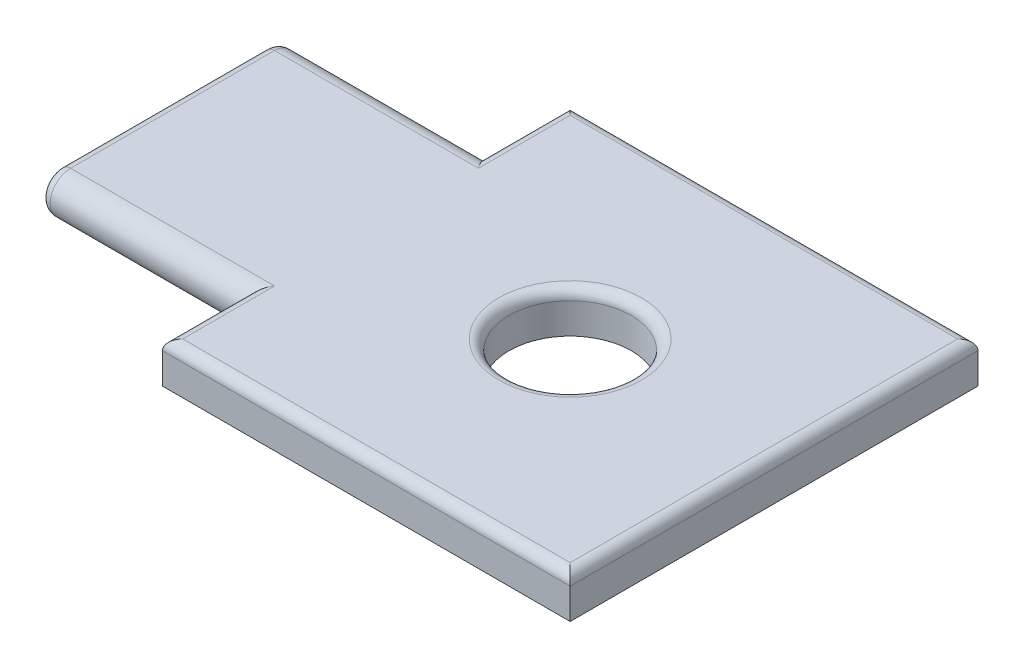
ISO-10303-21;
HEADER;
FILE_DESCRIPTION(('STEP AP214'),'2;1');
FILE_NAME('part.step','',(''),(''),'','','');
FILE_SCHEMA(('AUTOMOTIVE_DESIGN { 1 0 10303 214 1 1 1 1 }'));
ENDSEC;
DATA;
#1=APPLICATION_CONTEXT('core data for automotive mechanical design processes');
#2=APPLICATION_PROTOCOL_DEFINITION('international standard','automotive_design',2000,#1);
#3=PRODUCT_CONTEXT('',#1,'mechanical');
#4=PRODUCT('Part','Part','',(#3));
#5=PRODUCT_RELATED_PRODUCT_CATEGORY('part','',(#4));
#6=PRODUCT_DEFINITION_FORMATION('','',#4);
#7=PRODUCT_DEFINITION_CONTEXT('part definition',#1,'design');
#8=PRODUCT_DEFINITION('design','',#6,#7);
#9=PRODUCT_DEFINITION_SHAPE('','',#8);
#10=(LENGTH_UNIT() NAMED_UNIT(*) SI_UNIT(.MILLI.,.METRE.));
#11=(NAMED_UNIT(*) PLANE_ANGLE_UNIT() SI_UNIT($,.RADIAN.));
#12=(NAMED_UNIT(*) SI_UNIT($,.STERADIAN.) SOLID_ANGLE_UNIT());
#13=UNCERTAINTY_MEASURE_WITH_UNIT(LENGTH_MEASURE(1.E-05),#10,'distance_accuracy_value','');
#14=(GEOMETRIC_REPRESENTATION_CONTEXT(3) GLOBAL_UNCERTAINTY_ASSIGNED_CONTEXT((#13)) GLOBAL_UNIT_ASSIGNED_CONTEXT((#10,
#11,#12)) REPRESENTATION_CONTEXT('',''));
#15=CARTESIAN_POINT('',(0.,0.,0.));
#16=DIRECTION('',(0.,0.,1.));
#17=DIRECTION('',(1.,0.,0.));
#18=AXIS2_PLACEMENT_3D('',#15,#16,#17);
#19=CARTESIAN_POINT('',(-100.,20.,100.));
#20=DIRECTION('',(1.,0.,0.));
#21=DIRECTION('',(0.,0.,-1.));
#22=AXIS2_PLACEMENT_3D('',#19,#20,#21);
#23=PLANE('',#22);
#24=CARTESIAN_POINT('',(-100.,9.99999999999998,-50.));
#25=DIRECTION('',(-1.,0.,0.));
#26=DIRECTION('',(0.,0.,1.));
#27=AXIS2_PLACEMENT_3D('',#24,#25,#26);
#28=CIRCLE('',#27,10.);
#29=CARTESIAN_POINT('',(-100.,15.,-58.6602540378444));
#30=VERTEX_POINT('',#29);
#31=CARTESIAN_POINT('',(-100.,0.,-50.));
#32=VERTEX_POINT('',#31);
#33=EDGE_CURVE('E335',#30,#32,#28,.T.);
#34=ORIENTED_EDGE('',*,*,#33,.F.);
#35=DIRECTION('',(0.,0.,1.));
#36=VECTOR('',#35,1.);
#37=CARTESIAN_POINT('',(-100.,15.,100.));
#38=LINE('',#37,#36);
#39=CARTESIAN_POINT('',(-100.,15.,-100.));
#40=VERTEX_POINT('',#39);
#41=EDGE_CURVE('E70',#30,#40,#38,.F.);
#42=ORIENTED_EDGE('',*,*,#41,.T.);
#43=DIRECTION('',(0.,-1.,0.));
#44=VECTOR('',#43,1.);
#45=CARTESIAN_POINT('',(-100.,20.,-100.));
#46=LINE('',#45,#44);
#47=CARTESIAN_POINT('',(-100.,0.,-100.));
#48=VERTEX_POINT('',#47);
#49=EDGE_CURVE('E150',#40,#48,#46,.T.);
#50=ORIENTED_EDGE('',*,*,#49,.T.);
#51=DIRECTION('',(0.,0.,1.));
#52=VECTOR('',#51,1.);
#53=CARTESIAN_POINT('',(-100.,0.,100.));
#54=LINE('',#53,#52);
#55=EDGE_CURVE('E161',#48,#32,#54,.T.);
#56=ORIENTED_EDGE('',*,*,#55,.T.);
#57=EDGE_LOOP('',(#34,#42,#50,#56));
#58=FACE_BOUND('',#57,.T.);
#59=ADVANCED_FACE('F43',(#58),#23,.F.);
#60=CARTESIAN_POINT('',(0.,20.,0.));
#61=DIRECTION('',(0.,-1.,0.));
#62=DIRECTION('',(0.,0.,-1.));
#63=AXIS2_PLACEMENT_3D('',#60,#61,#62);
#64=PLANE('',#63);
#65=CARTESIAN_POINT('',(0.,20.,0.));
#66=DIRECTION('',(0.,-1.,0.));
#67=DIRECTION('',(0.,0.,-1.));
#68=AXIS2_PLACEMENT_3D('',#65,#66,#67);
#69=CIRCLE('',#68,35.);
#70=CARTESIAN_POINT('',(0.,20.,-35.));
#71=VERTEX_POINT('',#70);
#72=EDGE_CURVE('E236',#71,#71,#69,.T.);
#73=ORIENTED_EDGE('',*,*,#72,.T.);
#74=EDGE_LOOP('',(#73));
#75=FACE_BOUND('',#74,.T.);
#76=DIRECTION('',(1.,0.,0.));
#77=VECTOR('',#76,1.);
#78=CARTESIAN_POINT('',(-200.,20.,-50.));
#79=LINE('',#78,#77);
#80=CARTESIAN_POINT('',(-195.,20.,-50.));
#81=VERTEX_POINT('',#80);
#82=CARTESIAN_POINT('',(-95.,20.,-50.));
#83=VERTEX_POINT('',#82);
#84=EDGE_CURVE('E356',#81,#83,#79,.T.);
#85=ORIENTED_EDGE('',*,*,#84,.F.);
#86=DIRECTION('',(0.,0.,-1.));
#87=VECTOR('',#86,1.);
#88=CARTESIAN_POINT('',(-195.,20.,50.));
#89=LINE('',#88,#87);
#90=CARTESIAN_POINT('',(-195.,20.,50.));
#91=VERTEX_POINT('',#90);
#92=EDGE_CURVE('E233',#81,#91,#89,.F.);
#93=ORIENTED_EDGE('',*,*,#92,.T.);
#94=DIRECTION('',(1.,0.,0.));
#95=VECTOR('',#94,1.);
#96=CARTESIAN_POINT('',(-200.,20.,50.));
#97=LINE('',#96,#95);
#98=CARTESIAN_POINT('',(-95.,20.,50.));
#99=VERTEX_POINT('',#98);
#100=EDGE_CURVE('E367',#91,#99,#97,.T.);
#101=ORIENTED_EDGE('',*,*,#100,.T.);
#102=DIRECTION('',(0.,0.,1.));
#103=VECTOR('',#102,1.);
#104=CARTESIAN_POINT('',(-95.,20.,0.));
#105=LINE('',#104,#103);
#106=CARTESIAN_POINT('',(-95.,20.,95.));
#107=VERTEX_POINT('',#106);
#108=EDGE_CURVE('E230',#99,#107,#105,.T.);
#109=ORIENTED_EDGE('',*,*,#108,.T.);
#110=DIRECTION('',(1.,0.,0.));
#111=VECTOR('',#110,1.);
#112=CARTESIAN_POINT('',(0.,20.,95.));
#113=LINE('',#112,#111);
#114=CARTESIAN_POINT('',(95.,20.,95.));
#115=VERTEX_POINT('',#114);
#116=EDGE_CURVE('E226',#107,#115,#113,.T.);
#117=ORIENTED_EDGE('',*,*,#116,.T.);
#118=DIRECTION('',(0.,0.,-1.));
#119=VECTOR('',#118,1.);
#120=CARTESIAN_POINT('',(95.,20.,0.));
#121=LINE('',#120,#119);
#122=CARTESIAN_POINT('',(95.,20.,-95.));
#123=VERTEX_POINT('',#122);
#124=EDGE_CURVE('E216',#115,#123,#121,.T.);
#125=ORIENTED_EDGE('',*,*,#124,.T.);
#126=DIRECTION('',(-1.,0.,0.));
#127=VECTOR('',#126,1.);
#128=CARTESIAN_POINT('',(0.,20.,-95.));
#129=LINE('',#128,#127);
#130=CARTESIAN_POINT('',(-95.,20.,-95.));
#131=VERTEX_POINT('',#130);
#132=EDGE_CURVE('E219',#123,#131,#129,.T.);
#133=ORIENTED_EDGE('',*,*,#132,.T.);
#134=DIRECTION('',(0.,0.,1.));
#135=VECTOR('',#134,1.);
#136=CARTESIAN_POINT('',(-95.,20.,0.));
#137=LINE('',#136,#135);
#138=EDGE_CURVE('E222',#131,#83,#137,.T.);
#139=ORIENTED_EDGE('',*,*,#138,.T.);
#140=EDGE_LOOP('',(#85,#93,#101,#109,#117,#125,#133,#139));
#141=FACE_BOUND('',#140,.T.);
#142=ADVANCED_FACE('F287',(#75,#141),#64,.F.);
#143=CARTESIAN_POINT('',(0.,0.,0.));
#144=DIRECTION('',(0.,-1.,0.));
#145=DIRECTION('',(0.,0.,-1.));
#146=AXIS2_PLACEMENT_3D('',#143,#144,#145);
#147=PLANE('',#146);
#148=DIRECTION('',(1.,0.,0.));
#149=VECTOR('',#148,1.);
#150=CARTESIAN_POINT('',(-200.,0.,50.));
#151=LINE('',#150,#149);
#152=CARTESIAN_POINT('',(-195.,0.,50.));
#153=VERTEX_POINT('',#152);
#154=CARTESIAN_POINT('',(-100.,0.,50.));
#155=VERTEX_POINT('',#154);
#156=EDGE_CURVE('E361',#153,#155,#151,.T.);
#157=ORIENTED_EDGE('',*,*,#156,.F.);
#158=DIRECTION('',(0.,0.,1.));
#159=VECTOR('',#158,1.);
#160=CARTESIAN_POINT('',(-195.,0.,0.));
#161=LINE('',#160,#159);
#162=CARTESIAN_POINT('',(-195.,0.,-50.));
#163=VERTEX_POINT('',#162);
#164=EDGE_CURVE('E206',#153,#163,#161,.F.);
#165=ORIENTED_EDGE('',*,*,#164,.T.);
#166=DIRECTION('',(1.,0.,0.));
#167=VECTOR('',#166,1.);
#168=CARTESIAN_POINT('',(-200.,0.,-50.));
#169=LINE('',#168,#167);
#170=EDGE_CURVE('E174',#163,#32,#169,.T.);
#171=ORIENTED_EDGE('',*,*,#170,.T.);
#172=ORIENTED_EDGE('',*,*,#55,.F.);
#173=DIRECTION('',(-1.,0.,0.));
#174=VECTOR('',#173,1.);
#175=CARTESIAN_POINT('',(-100.,0.,-100.));
#176=LINE('',#175,#174);
#177=CARTESIAN_POINT('',(100.,0.,-100.));
#178=VERTEX_POINT('',#177);
#179=EDGE_CURVE('E143',#178,#48,#176,.T.);
#180=ORIENTED_EDGE('',*,*,#179,.F.);
#181=DIRECTION('',(0.,0.,-1.));
#182=VECTOR('',#181,1.);
#183=CARTESIAN_POINT('',(100.,0.,100.));
#184=LINE('',#183,#182);
#185=CARTESIAN_POINT('',(100.,0.,100.));
#186=VERTEX_POINT('',#185);
#187=EDGE_CURVE('E158',#186,#178,#184,.T.);
#188=ORIENTED_EDGE('',*,*,#187,.F.);
#189=DIRECTION('',(1.,0.,0.));
#190=VECTOR('',#189,1.);
#191=CARTESIAN_POINT('',(-100.,0.,100.));
#192=LINE('',#191,#190);
#193=CARTESIAN_POINT('',(-100.,0.,100.));
#194=VERTEX_POINT('',#193);
#195=EDGE_CURVE('E180',#194,#186,#192,.T.);
#196=ORIENTED_EDGE('',*,*,#195,.F.);
#197=EDGE_CURVE('E163',#155,#194,#54,.T.);
#198=ORIENTED_EDGE('',*,*,#197,.F.);
#199=EDGE_LOOP('',(#157,#165,#171,#172,#180,#188,#196,#198));
#200=FACE_BOUND('',#199,.T.);
#201=CARTESIAN_POINT('',(0.,0.,0.));
#202=DIRECTION('',(0.,1.,0.));
#203=DIRECTION('',(0.,0.,1.));
#204=AXIS2_PLACEMENT_3D('',#201,#202,#203);
#205=CIRCLE('',#204,30.);
#206=CARTESIAN_POINT('',(0.,0.,30.));
#207=VERTEX_POINT('',#206);
#208=EDGE_CURVE('E170',#207,#207,#205,.T.);
#209=ORIENTED_EDGE('',*,*,#208,.T.);
#210=EDGE_LOOP('',(#209));
#211=FACE_BOUND('',#210,.T.);
#212=ADVANCED_FACE('F155',(#200,#211),#147,.T.);
#213=CARTESIAN_POINT('',(100.,20.,100.));
#214=DIRECTION('',(-1.,0.,0.));
#215=DIRECTION('',(0.,0.,1.));
#216=AXIS2_PLACEMENT_3D('',#213,#214,#215);
#217=PLANE('',#216);
#218=DIRECTION('',(0.,-1.,0.));
#219=VECTOR('',#218,1.);
#220=CARTESIAN_POINT('',(100.,20.,-100.));
#221=LINE('',#220,#219);
#222=CARTESIAN_POINT('',(100.,15.,-100.));
#223=VERTEX_POINT('',#222);
#224=EDGE_CURVE('E140',#223,#178,#221,.T.);
#225=ORIENTED_EDGE('',*,*,#224,.F.);
#226=DIRECTION('',(0.,0.,-1.));
#227=VECTOR('',#226,1.);
#228=CARTESIAN_POINT('',(100.,15.,100.));
#229=LINE('',#228,#227);
#230=CARTESIAN_POINT('',(100.,15.,100.));
#231=VERTEX_POINT('',#230);
#232=EDGE_CURVE('E250',#223,#231,#229,.F.);
#233=ORIENTED_EDGE('',*,*,#232,.T.);
#234=DIRECTION('',(0.,-1.,0.));
#235=VECTOR('',#234,1.);
#236=CARTESIAN_POINT('',(100.,20.,100.));
#237=LINE('',#236,#235);
#238=EDGE_CURVE('E167',#231,#186,#237,.T.);
#239=ORIENTED_EDGE('',*,*,#238,.T.);
#240=ORIENTED_EDGE('',*,*,#187,.T.);
#241=EDGE_LOOP('',(#225,#233,#239,#240));
#242=FACE_BOUND('',#241,.T.);
#243=ADVANCED_FACE('F165',(#242),#217,.F.);
#244=CARTESIAN_POINT('',(-100.,20.,-100.));
#245=DIRECTION('',(0.,0.,1.));
#246=DIRECTION('',(1.,0.,0.));
#247=AXIS2_PLACEMENT_3D('',#244,#245,#246);
#248=PLANE('',#247);
#249=ORIENTED_EDGE('',*,*,#49,.F.);
#250=DIRECTION('',(-1.,0.,0.));
#251=VECTOR('',#250,1.);
#252=CARTESIAN_POINT('',(-100.,15.,-100.));
#253=LINE('',#252,#251);
#254=EDGE_CURVE('E62',#40,#223,#253,.F.);
#255=ORIENTED_EDGE('',*,*,#254,.T.);
#256=ORIENTED_EDGE('',*,*,#224,.T.);
#257=ORIENTED_EDGE('',*,*,#179,.T.);
#258=EDGE_LOOP('',(#249,#255,#256,#257));
#259=FACE_BOUND('',#258,.T.);
#260=ADVANCED_FACE('F142',(#259),#248,.F.);
#261=DIRECTION('',(0.,-1.,0.));
#262=VECTOR('',#261,1.);
#263=CARTESIAN_POINT('',(-100.,20.,100.));
#264=LINE('',#263,#262);
#265=CARTESIAN_POINT('',(-100.,15.,100.));
#266=VERTEX_POINT('',#265);
#267=EDGE_CURVE('E185',#266,#194,#264,.T.);
#268=ORIENTED_EDGE('',*,*,#267,.F.);
#269=DIRECTION('',(0.,0.,1.));
#270=VECTOR('',#269,1.);
#271=CARTESIAN_POINT('',(-100.,15.,100.));
#272=LINE('',#271,#270);
#273=CARTESIAN_POINT('',(-100.,15.,58.6602540378444));
#274=VERTEX_POINT('',#273);
#275=EDGE_CURVE('E243',#266,#274,#272,.F.);
#276=ORIENTED_EDGE('',*,*,#275,.T.);
#277=CARTESIAN_POINT('',(-100.,10.,50.));
#278=DIRECTION('',(-1.,0.,0.));
#279=DIRECTION('',(0.,0.,1.));
#280=AXIS2_PLACEMENT_3D('',#277,#278,#279);
#281=CIRCLE('',#280,10.);
#282=EDGE_CURVE('E375',#155,#274,#281,.T.);
#283=ORIENTED_EDGE('',*,*,#282,.F.);
#284=ORIENTED_EDGE('',*,*,#197,.T.);
#285=EDGE_LOOP('',(#268,#276,#283,#284));
#286=FACE_BOUND('',#285,.T.);
#287=ADVANCED_FACE('F289',(#286),#23,.F.);
#288=CARTESIAN_POINT('',(-100.,20.,100.));
#289=DIRECTION('',(0.,0.,-1.));
#290=DIRECTION('',(-1.,0.,0.));
#291=AXIS2_PLACEMENT_3D('',#288,#289,#290);
#292=PLANE('',#291);
#293=ORIENTED_EDGE('',*,*,#238,.F.);
#294=DIRECTION('',(1.,0.,0.));
#295=VECTOR('',#294,1.);
#296=CARTESIAN_POINT('',(-100.,15.,100.));
#297=LINE('',#296,#295);
#298=EDGE_CURVE('E240',#231,#266,#297,.F.);
#299=ORIENTED_EDGE('',*,*,#298,.T.);
#300=ORIENTED_EDGE('',*,*,#267,.T.);
#301=ORIENTED_EDGE('',*,*,#195,.T.);
#302=EDGE_LOOP('',(#293,#299,#300,#301));
#303=FACE_BOUND('',#302,.T.);
#304=ADVANCED_FACE('F298',(#303),#292,.F.);
#305=CARTESIAN_POINT('',(0.,20.,0.));
#306=DIRECTION('',(0.,-1.,0.));
#307=DIRECTION('',(0.,0.,-1.));
#308=AXIS2_PLACEMENT_3D('',#305,#306,#307);
#309=CYLINDRICAL_SURFACE('',#308,30.);
#310=CARTESIAN_POINT('',(0.,15.,0.));
#311=DIRECTION('',(0.,-1.,0.));
#312=DIRECTION('',(0.,0.,-1.));
#313=AXIS2_PLACEMENT_3D('',#310,#311,#312);
#314=CIRCLE('',#313,30.);
#315=CARTESIAN_POINT('',(0.,15.,-30.));
#316=VERTEX_POINT('',#315);
#317=EDGE_CURVE('E212',#316,#316,#314,.F.);
#318=ORIENTED_EDGE('',*,*,#317,.T.);
#319=EDGE_LOOP('',(#318));
#320=FACE_BOUND('',#319,.T.);
#321=ORIENTED_EDGE('',*,*,#208,.F.);
#322=EDGE_LOOP('',(#321));
#323=FACE_BOUND('',#322,.T.);
#324=ADVANCED_FACE('F304',(#320,#323),#309,.F.);
#325=CARTESIAN_POINT('',(-200.,9.99999999999998,-50.));
#326=DIRECTION('',(1.,0.,0.));
#327=DIRECTION('',(0.,0.,-1.));
#328=AXIS2_PLACEMENT_3D('',#325,#326,#327);
#329=CYLINDRICAL_SURFACE('',#328,10.);
#330=ORIENTED_EDGE('',*,*,#170,.F.);
#331=CARTESIAN_POINT('',(-195.,9.99999999999998,-50.));
#332=DIRECTION('',(-1.,0.,0.));
#333=DIRECTION('',(0.,0.,1.));
#334=AXIS2_PLACEMENT_3D('',#331,#332,#333);
#335=CIRCLE('',#334,10.);
#336=EDGE_CURVE('E209',#163,#81,#335,.F.);
#337=ORIENTED_EDGE('',*,*,#336,.T.);
#338=ORIENTED_EDGE('',*,*,#84,.T.);
#339=CARTESIAN_POINT('',(-100.,15.,-58.6602540378444));
#340=CARTESIAN_POINT('',(-99.9999997170992,15.0936098039846,-58.6062120074579));
#341=CARTESIAN_POINT('',(-99.9973711254486,15.1863112644488,-58.5506629549523));
#342=CARTESIAN_POINT('',(-99.987162747067,15.3696413860291,-58.4367401323219));
#343=CARTESIAN_POINT('',(-99.9795846933112,15.4602707611617,-58.3783673574997));
#344=CARTESIAN_POINT('',(-99.9499356449879,15.7282724403873,-58.1995669808719));
#345=CARTESIAN_POINT('',(-99.9209463478675,15.9022749609299,-58.0751585438732));
#346=CARTESIAN_POINT('',(-99.8474381423291,16.2375074983295,-57.8190444347571));
#347=CARTESIAN_POINT('',(-99.8031300184605,16.3988761663666,-57.6874572455092));
#348=CARTESIAN_POINT('',(-99.7010728354151,16.7108067987724,-57.4167214008654));
#349=CARTESIAN_POINT('',(-99.6433138874911,16.8613607052983,-57.2775672403728));
#350=CARTESIAN_POINT('',(-99.5042647790966,17.1787769966393,-56.9658882846561));
#351=CARTESIAN_POINT('',(-99.4205886204641,17.3432986936852,-56.7920485868775));
#352=CARTESIAN_POINT('',(-99.2398862757638,17.6563187489269,-56.4371417351844));
#353=CARTESIAN_POINT('',(-99.1428598040348,17.8048167641372,-56.256074426677));
#354=CARTESIAN_POINT('',(-98.9372584447289,18.0868459912034,-55.8870329415342));
#355=CARTESIAN_POINT('',(-98.8286218101965,18.2202885435338,-55.6990257094262));
#356=CARTESIAN_POINT('',(-98.6022382977953,18.4716706657228,-55.3181653013097));
#357=CARTESIAN_POINT('',(-98.484488765641,18.5896056915504,-55.1253107245583));
#358=CARTESIAN_POINT('',(-98.1923307795048,18.8551586322552,-54.6567359381831));
#359=CARTESIAN_POINT('',(-98.0142968489603,18.9954410395127,-54.3791023632746));
#360=CARTESIAN_POINT('',(-97.6472999264086,19.2475148602266,-53.8181264418126));
#361=CARTESIAN_POINT('',(-97.4583320759375,19.3592934869397,-53.5347815944777));
#362=CARTESIAN_POINT('',(-97.0727902786241,19.5552412924625,-52.964477925599));
#363=CARTESIAN_POINT('',(-96.8762282165369,19.6394518022136,-52.6775251900953));
#364=CARTESIAN_POINT('',(-96.4777725942474,19.7813060533287,-52.1009854917756));
#365=CARTESIAN_POINT('',(-96.275881369257,19.8389612332895,-51.811399718047));
#366=CARTESIAN_POINT('',(-95.8970842025873,19.9221379454986,-51.2709081621249));
#367=CARTESIAN_POINT('',(-95.7205991989891,19.9510085495314,-51.0202117513085));
#368=CARTESIAN_POINT('',(-95.3665790623172,19.9897179572052,-50.5184326159946));
#369=CARTESIAN_POINT('',(-95.1890452341951,19.9995768157015,-50.2673505784968));
#370=CARTESIAN_POINT('',(-95.0076979829248,19.9999955542052,-50.0108865921041));
#371=CARTESIAN_POINT('',(-95.0038489797647,19.9999999985291,-50.005443279648));
#372=CARTESIAN_POINT('',(-95.,20.,-50.));
#373=B_SPLINE_CURVE_WITH_KNOTS('',3,(#339,#340,#341,#342,#343,#344,#345,#346,#347,#348,#349,
#350,#351,#352,#353,#354,#355,#356,#357,#358,#359,#360,#361,#362,#363,#364,#365,#366,#367,#368,
#369,#370,#371,#372),.UNSPECIFIED.,.F.,.F.,(4,2,2,2,2,2,2,2,2,2,2,2,2,2,2,2,4),(0.,
0.324164501698483,0.648215563168634,1.29453690514952,1.93229735394089,2.57052815854178,
3.33008992767346,4.08966795194233,4.8535082233845,5.6175718196543,6.6912294796663,
7.76536793656724,8.83788855857041,9.90994676377602,10.8332249647612,11.7555286965104,
11.7755287009548),.UNSPECIFIED.);
#374=EDGE_CURVE('E11',#83,#30,#373,.F.);
#375=ORIENTED_EDGE('',*,*,#374,.T.);
#376=ORIENTED_EDGE('',*,*,#33,.T.);
#377=EDGE_LOOP('',(#330,#337,#338,#375,#376));
#378=FACE_BOUND('',#377,.T.);
#379=ADVANCED_FACE('F380',(#378),#329,.T.);
#380=CARTESIAN_POINT('',(-200.,10.,50.));
#381=DIRECTION('',(1.,0.,0.));
#382=DIRECTION('',(0.,0.,-1.));
#383=AXIS2_PLACEMENT_3D('',#380,#381,#382);
#384=CYLINDRICAL_SURFACE('',#383,10.);
#385=ORIENTED_EDGE('',*,*,#100,.F.);
#386=CARTESIAN_POINT('',(-195.,10.,50.));
#387=DIRECTION('',(-1.,0.,0.));
#388=DIRECTION('',(0.,0.,1.));
#389=AXIS2_PLACEMENT_3D('',#386,#387,#388);
#390=CIRCLE('',#389,10.);
#391=EDGE_CURVE('E202',#91,#153,#390,.F.);
#392=ORIENTED_EDGE('',*,*,#391,.T.);
#393=ORIENTED_EDGE('',*,*,#156,.T.);
#394=ORIENTED_EDGE('',*,*,#282,.T.);
#395=CARTESIAN_POINT('',(-100.,15.,58.6602540378444));
#396=CARTESIAN_POINT('',(-99.9999997170992,15.0936098039849,58.6062120074577));
#397=CARTESIAN_POINT('',(-99.9973711254486,15.1863112644494,58.5506629549519));
#398=CARTESIAN_POINT('',(-99.987162747067,15.3696413860303,58.4367401323211));
#399=CARTESIAN_POINT('',(-99.9795846933111,15.4602707611632,58.3783673574988));
#400=CARTESIAN_POINT('',(-99.9499356449875,15.7282724403895,58.1995669808704));
#401=CARTESIAN_POINT('',(-99.920946347867,15.9022749609327,58.0751585438712));
#402=CARTESIAN_POINT('',(-99.8474381423284,16.2375074983321,57.819044434755));
#403=CARTESIAN_POINT('',(-99.8031300184599,16.3988761663687,57.6874572455075));
#404=CARTESIAN_POINT('',(-99.7010728354147,16.7108067987734,57.4167214008645));
#405=CARTESIAN_POINT('',(-99.6433138874909,16.8613607052987,57.2775672403724));
#406=CARTESIAN_POINT('',(-99.5042647790967,17.178776996639,56.9658882846564));
#407=CARTESIAN_POINT('',(-99.4205886204643,17.3432986936847,56.7920485868781));
#408=CARTESIAN_POINT('',(-99.2398862757644,17.656318748926,56.4371417351855));
#409=CARTESIAN_POINT('',(-99.1428598040356,17.804816764136,56.2560744266785));
#410=CARTESIAN_POINT('',(-98.9372584447297,18.0868459912024,55.8870329415357));
#411=CARTESIAN_POINT('',(-98.8286218101972,18.220288543533,55.6990257094274));
#412=CARTESIAN_POINT('',(-98.6022382977957,18.4716706657224,55.3181653013104));
#413=CARTESIAN_POINT('',(-98.4844887656411,18.5896056915502,55.1253107245587));
#414=CARTESIAN_POINT('',(-98.1923307795046,18.8551586322554,54.6567359381828));
#415=CARTESIAN_POINT('',(-98.0142968489601,18.9954410395131,54.3791023632737));
#416=CARTESIAN_POINT('',(-97.6472999264074,19.2475148602272,53.8181264418114));
#417=CARTESIAN_POINT('',(-97.4583320759354,19.3592934869404,53.5347815944766));
#418=CARTESIAN_POINT('',(-97.0727902786238,19.555241292463,52.9644779255967));
#419=CARTESIAN_POINT('',(-96.8762282165394,19.639451802214,52.6775251900917));
#420=CARTESIAN_POINT('',(-96.4777725942435,19.7813060533289,52.1009854917775));
#421=CARTESIAN_POINT('',(-96.275881369244,19.8389612332895,51.8113997180559));
#422=CARTESIAN_POINT('',(-95.8970842025983,19.9221379454986,51.2709081621173));
#423=CARTESIAN_POINT('',(-95.7205991990276,19.9510085495313,51.0202117512815));
#424=CARTESIAN_POINT('',(-95.3665790622785,19.9897179572053,50.5184326160222));
#425=CARTESIAN_POINT('',(-95.1890452340519,19.9995768157016,50.2673505785981));
#426=CARTESIAN_POINT('',(-95.0076979829187,19.9999955542052,50.0108865921084));
#427=CARTESIAN_POINT('',(-95.0038489797615,19.9999999985291,50.0054432796502));
#428=CARTESIAN_POINT('',(-95.,20.,50.));
#429=B_SPLINE_CURVE_WITH_KNOTS('',3,(#395,#396,#397,#398,#399,#400,#401,#402,#403,#404,#405,
#406,#407,#408,#409,#410,#411,#412,#413,#414,#415,#416,#417,#418,#419,#420,#421,#422,#423,#424,
#425,#426,#427,#428),.UNSPECIFIED.,.F.,.F.,(4,2,2,2,2,2,2,2,2,2,2,2,2,2,2,2,4),(0.,
0.324164501699531,0.648215563170731,1.29453690515366,1.93229735394295,2.57052815854178,
3.33008992767228,4.08966795193992,4.85350822338327,5.61757181965429,6.69122947966778,
7.76536793656989,8.8378885585715,9.90994676377593,10.833224964761,11.7555286965104,
11.7755287009549),.UNSPECIFIED.);
#430=EDGE_CURVE('E54',#274,#99,#429,.T.);
#431=ORIENTED_EDGE('',*,*,#430,.T.);
#432=EDGE_LOOP('',(#385,#392,#393,#394,#431));
#433=FACE_BOUND('',#432,.T.);
#434=ADVANCED_FACE('F267',(#433),#384,.T.);
#435=CARTESIAN_POINT('',(-200.,9.99999999999998,-50.));
#436=DIRECTION('',(-1.,0.,0.));
#437=DIRECTION('',(0.,0.,1.));
#438=AXIS2_PLACEMENT_3D('',#435,#436,#437);
#439=PLANE('',#438);
#440=DIRECTION('',(0.,0.,1.));
#441=VECTOR('',#440,1.);
#442=CARTESIAN_POINT('',(-200.,5.,-50.));
#443=LINE('',#442,#441);
#444=CARTESIAN_POINT('',(-200.,4.99999999999998,-50.));
#445=VERTEX_POINT('',#444);
#446=CARTESIAN_POINT('',(-200.,5.,50.));
#447=VERTEX_POINT('',#446);
#448=EDGE_CURVE('E195',#445,#447,#443,.T.);
#449=ORIENTED_EDGE('',*,*,#448,.T.);
#450=CARTESIAN_POINT('',(-200.,10.,50.));
#451=DIRECTION('',(-1.,0.,0.));
#452=DIRECTION('',(0.,0.,1.));
#453=AXIS2_PLACEMENT_3D('',#450,#451,#452);
#454=CIRCLE('',#453,5.);
#455=CARTESIAN_POINT('',(-200.,15.,50.));
#456=VERTEX_POINT('',#455);
#457=EDGE_CURVE('E198',#447,#456,#454,.T.);
#458=ORIENTED_EDGE('',*,*,#457,.T.);
#459=DIRECTION('',(0.,0.,-1.));
#460=VECTOR('',#459,1.);
#461=CARTESIAN_POINT('',(-200.,15.,-50.));
#462=LINE('',#461,#460);
#463=CARTESIAN_POINT('',(-200.,15.,-50.));
#464=VERTEX_POINT('',#463);
#465=EDGE_CURVE('E149',#456,#464,#462,.T.);
#466=ORIENTED_EDGE('',*,*,#465,.T.);
#467=CARTESIAN_POINT('',(-200.,9.99999999999998,-50.));
#468=DIRECTION('',(-1.,0.,0.));
#469=DIRECTION('',(0.,0.,1.));
#470=AXIS2_PLACEMENT_3D('',#467,#468,#469);
#471=CIRCLE('',#470,5.);
#472=EDGE_CURVE('E192',#464,#445,#471,.T.);
#473=ORIENTED_EDGE('',*,*,#472,.T.);
#474=EDGE_LOOP('',(#449,#458,#466,#473));
#475=FACE_BOUND('',#474,.T.);
#476=ADVANCED_FACE('F392',(#475),#439,.T.);
#477=CARTESIAN_POINT('',(-195.,9.99999999999998,-50.));
#478=DIRECTION('',(-1.,0.,0.));
#479=DIRECTION('',(0.,0.,1.));
#480=AXIS2_PLACEMENT_3D('',#477,#478,#479);
#481=DEGENERATE_TOROIDAL_SURFACE('',#480,5.,5.,.T.);
#482=CARTESIAN_POINT('',(-195.,15.,-50.));
#483=DIRECTION('',(0.,0.,1.));
#484=DIRECTION('',(1.,0.,0.));
#485=AXIS2_PLACEMENT_3D('',#482,#483,#484);
#486=CIRCLE('',#485,5.);
#487=EDGE_CURVE('E336',#81,#464,#486,.T.);
#488=ORIENTED_EDGE('',*,*,#487,.F.);
#489=ORIENTED_EDGE('',*,*,#336,.F.);
#490=CARTESIAN_POINT('',(-195.,4.99999999999998,-50.));
#491=DIRECTION('',(0.,0.,1.));
#492=DIRECTION('',(1.,0.,0.));
#493=AXIS2_PLACEMENT_3D('',#490,#491,#492);
#494=CIRCLE('',#493,5.);
#495=EDGE_CURVE('E331',#445,#163,#494,.T.);
#496=ORIENTED_EDGE('',*,*,#495,.F.);
#497=ORIENTED_EDGE('',*,*,#472,.F.);
#498=EDGE_LOOP('',(#488,#489,#496,#497));
#499=FACE_BOUND('',#498,.T.);
#500=ADVANCED_FACE('F384',(#499),#481,.T.);
#501=CARTESIAN_POINT('',(-195.,5.,-50.));
#502=DIRECTION('',(0.,0.,1.));
#503=DIRECTION('',(1.,0.,0.));
#504=AXIS2_PLACEMENT_3D('',#501,#502,#503);
#505=CYLINDRICAL_SURFACE('',#504,5.);
#506=ORIENTED_EDGE('',*,*,#495,.T.);
#507=ORIENTED_EDGE('',*,*,#164,.F.);
#508=CARTESIAN_POINT('',(-195.,5.,50.));
#509=DIRECTION('',(0.,0.,1.));
#510=DIRECTION('',(0.,-1.,0.));
#511=AXIS2_PLACEMENT_3D('',#508,#509,#510);
#512=CIRCLE('',#511,5.);
#513=EDGE_CURVE('E340',#447,#153,#512,.T.);
#514=ORIENTED_EDGE('',*,*,#513,.F.);
#515=ORIENTED_EDGE('',*,*,#448,.F.);
#516=EDGE_LOOP('',(#506,#507,#514,#515));
#517=FACE_BOUND('',#516,.T.);
#518=ADVANCED_FACE('F389',(#517),#505,.T.);
#519=CARTESIAN_POINT('',(-195.,15.,-50.));
#520=DIRECTION('',(0.,0.,1.));
#521=DIRECTION('',(1.,0.,0.));
#522=AXIS2_PLACEMENT_3D('',#519,#520,#521);
#523=CYLINDRICAL_SURFACE('',#522,5.);
#524=ORIENTED_EDGE('',*,*,#487,.T.);
#525=ORIENTED_EDGE('',*,*,#465,.F.);
#526=CARTESIAN_POINT('',(-195.,15.,50.));
#527=DIRECTION('',(0.,0.,1.));
#528=DIRECTION('',(1.,0.,0.));
#529=AXIS2_PLACEMENT_3D('',#526,#527,#528);
#530=CIRCLE('',#529,5.);
#531=EDGE_CURVE('E342',#91,#456,#530,.T.);
#532=ORIENTED_EDGE('',*,*,#531,.F.);
#533=ORIENTED_EDGE('',*,*,#92,.F.);
#534=EDGE_LOOP('',(#524,#525,#532,#533));
#535=FACE_BOUND('',#534,.T.);
#536=ADVANCED_FACE('F394',(#535),#523,.T.);
#537=CARTESIAN_POINT('',(-195.,10.,50.));
#538=DIRECTION('',(-1.,0.,0.));
#539=DIRECTION('',(0.,0.,1.));
#540=AXIS2_PLACEMENT_3D('',#537,#538,#539);
#541=DEGENERATE_TOROIDAL_SURFACE('',#540,5.,5.,.T.);
#542=ORIENTED_EDGE('',*,*,#513,.T.);
#543=ORIENTED_EDGE('',*,*,#391,.F.);
#544=ORIENTED_EDGE('',*,*,#531,.T.);
#545=ORIENTED_EDGE('',*,*,#457,.F.);
#546=EDGE_LOOP('',(#542,#543,#544,#545));
#547=FACE_BOUND('',#546,.T.);
#548=ADVANCED_FACE('F396',(#547),#541,.T.);
#549=CARTESIAN_POINT('',(0.,15.,0.));
#550=DIRECTION('',(0.,-1.,0.));
#551=DIRECTION('',(0.,0.,-1.));
#552=AXIS2_PLACEMENT_3D('',#549,#550,#551);
#553=TOROIDAL_SURFACE('',#552,35.,5.);
#554=ORIENTED_EDGE('',*,*,#72,.F.);
#555=EDGE_LOOP('',(#554));
#556=FACE_BOUND('',#555,.T.);
#557=ORIENTED_EDGE('',*,*,#317,.F.);
#558=EDGE_LOOP('',(#557));
#559=FACE_BOUND('',#558,.T.);
#560=ADVANCED_FACE('F283',(#556,#559),#553,.T.);
#561=CARTESIAN_POINT('',(-95.,15.,0.));
#562=DIRECTION('',(0.,0.,1.));
#563=DIRECTION('',(1.,0.,0.));
#564=AXIS2_PLACEMENT_3D('',#561,#562,#563);
#565=CYLINDRICAL_SURFACE('',#564,5.);
#566=ORIENTED_EDGE('',*,*,#374,.F.);
#567=ORIENTED_EDGE('',*,*,#138,.F.);
#568=CARTESIAN_POINT('',(-95.,15.,-95.));
#569=DIRECTION('',(-0.707106781186547,0.,0.707106781186547));
#570=DIRECTION('',(-0.707106781186547,0.,-0.707106781186547));
#571=AXIS2_PLACEMENT_3D('',#568,#569,#570);
#572=ELLIPSE('',#571,7.07106781186547,5.);
#573=EDGE_CURVE('E48',#40,#131,#572,.F.);
#574=ORIENTED_EDGE('',*,*,#573,.F.);
#575=ORIENTED_EDGE('',*,*,#41,.F.);
#576=EDGE_LOOP('',(#566,#567,#574,#575));
#577=FACE_BOUND('',#576,.T.);
#578=ADVANCED_FACE('F45',(#577),#565,.T.);
#579=CARTESIAN_POINT('',(0.,15.,-95.));
#580=DIRECTION('',(-1.,0.,0.));
#581=DIRECTION('',(0.,0.,1.));
#582=AXIS2_PLACEMENT_3D('',#579,#580,#581);
#583=CYLINDRICAL_SURFACE('',#582,5.);
#584=ORIENTED_EDGE('',*,*,#573,.T.);
#585=ORIENTED_EDGE('',*,*,#132,.F.);
#586=CARTESIAN_POINT('',(95.,15.,-95.));
#587=DIRECTION('',(-0.707106781186547,0.,-0.707106781186547));
#588=DIRECTION('',(0.707106781186547,0.,-0.707106781186547));
#589=AXIS2_PLACEMENT_3D('',#586,#587,#588);
#590=ELLIPSE('',#589,7.07106781186547,5.);
#591=EDGE_CURVE('E323',#223,#123,#590,.F.);
#592=ORIENTED_EDGE('',*,*,#591,.F.);
#593=ORIENTED_EDGE('',*,*,#254,.F.);
#594=EDGE_LOOP('',(#584,#585,#592,#593));
#595=FACE_BOUND('',#594,.T.);
#596=ADVANCED_FACE('F275',(#595),#583,.T.);
#597=CARTESIAN_POINT('',(-95.,15.,0.));
#598=DIRECTION('',(0.,0.,1.));
#599=DIRECTION('',(1.,0.,0.));
#600=AXIS2_PLACEMENT_3D('',#597,#598,#599);
#601=CYLINDRICAL_SURFACE('',#600,5.);
#602=ORIENTED_EDGE('',*,*,#430,.F.);
#603=ORIENTED_EDGE('',*,*,#275,.F.);
#604=CARTESIAN_POINT('',(-95.,15.,95.));
#605=DIRECTION('',(0.707106781186547,0.,0.707106781186547));
#606=DIRECTION('',(-0.707106781186547,0.,0.707106781186547));
#607=AXIS2_PLACEMENT_3D('',#604,#605,#606);
#608=ELLIPSE('',#607,7.07106781186547,5.);
#609=EDGE_CURVE('E316',#107,#266,#608,.T.);
#610=ORIENTED_EDGE('',*,*,#609,.F.);
#611=ORIENTED_EDGE('',*,*,#108,.F.);
#612=EDGE_LOOP('',(#602,#603,#610,#611));
#613=FACE_BOUND('',#612,.T.);
#614=ADVANCED_FACE('F270',(#613),#601,.T.);
#615=CARTESIAN_POINT('',(95.,15.,0.));
#616=DIRECTION('',(0.,0.,-1.));
#617=DIRECTION('',(-1.,0.,0.));
#618=AXIS2_PLACEMENT_3D('',#615,#616,#617);
#619=CYLINDRICAL_SURFACE('',#618,5.);
#620=ORIENTED_EDGE('',*,*,#591,.T.);
#621=ORIENTED_EDGE('',*,*,#124,.F.);
#622=CARTESIAN_POINT('',(95.,15.,95.));
#623=DIRECTION('',(0.707106781186547,0.,-0.707106781186547));
#624=DIRECTION('',(-0.707106781186547,0.,-0.707106781186547));
#625=AXIS2_PLACEMENT_3D('',#622,#623,#624);
#626=ELLIPSE('',#625,7.07106781186547,5.);
#627=EDGE_CURVE('E324',#231,#115,#626,.F.);
#628=ORIENTED_EDGE('',*,*,#627,.F.);
#629=ORIENTED_EDGE('',*,*,#232,.F.);
#630=EDGE_LOOP('',(#620,#621,#628,#629));
#631=FACE_BOUND('',#630,.T.);
#632=ADVANCED_FACE('F274',(#631),#619,.T.);
#633=CARTESIAN_POINT('',(0.,15.,95.));
#634=DIRECTION('',(1.,0.,0.));
#635=DIRECTION('',(0.,0.,-1.));
#636=AXIS2_PLACEMENT_3D('',#633,#634,#635);
#637=CYLINDRICAL_SURFACE('',#636,5.);
#638=ORIENTED_EDGE('',*,*,#609,.T.);
#639=ORIENTED_EDGE('',*,*,#298,.F.);
#640=ORIENTED_EDGE('',*,*,#627,.T.);
#641=ORIENTED_EDGE('',*,*,#116,.F.);
#642=EDGE_LOOP('',(#638,#639,#640,#641));
#643=FACE_BOUND('',#642,.T.);
#644=ADVANCED_FACE('F320',(#643),#637,.T.);
#645=CLOSED_SHELL('',(#59,#142,#212,#243,#260,#287,#304,#324,#379,#434,#476,#500,#518,#536,#548,
#560,#578,#596,#614,#632,#644));
#646=MANIFOLD_SOLID_BREP('B2',#645);
#647=ADVANCED_BREP_SHAPE_REPRESENTATION('',(#18,#646),#14);
#648=SHAPE_DEFINITION_REPRESENTATION(#9,#647);
ENDSEC;
END-ISO-10303-21;
